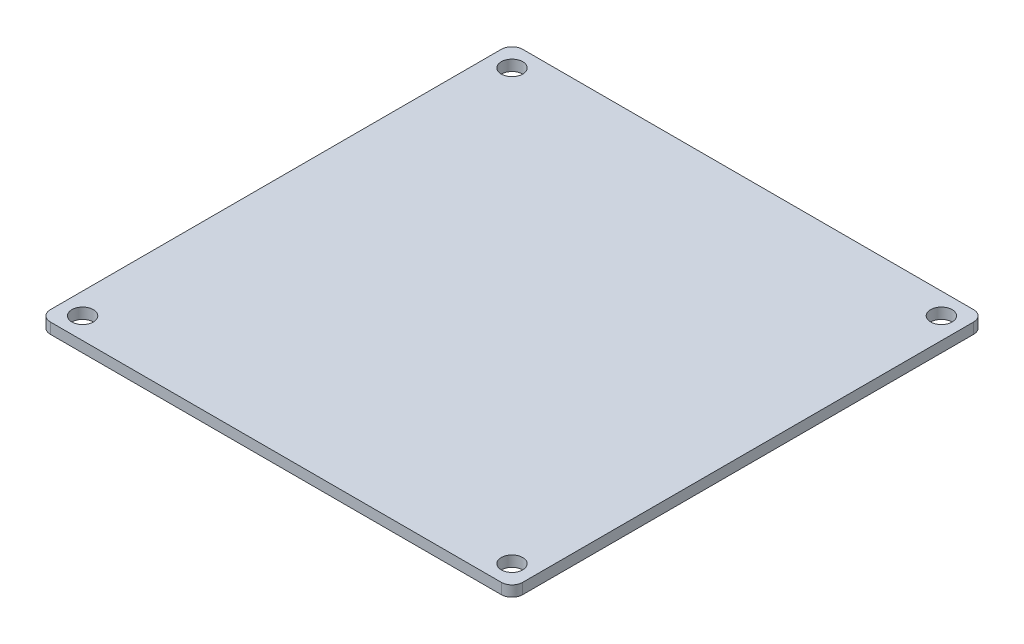
ISO-10303-21;
HEADER;
FILE_DESCRIPTION(('STEP AP214'),'2;1');
FILE_NAME('part.step','',(''),(''),'','','');
FILE_SCHEMA(('AUTOMOTIVE_DESIGN { 1 0 10303 214 1 1 1 1 }'));
ENDSEC;
DATA;
#1=APPLICATION_CONTEXT('core data for automotive mechanical design processes');
#2=APPLICATION_PROTOCOL_DEFINITION('international standard','automotive_design',2000,#1);
#3=PRODUCT_CONTEXT('',#1,'mechanical');
#4=PRODUCT('Part','Part','',(#3));
#5=PRODUCT_RELATED_PRODUCT_CATEGORY('part','',(#4));
#6=PRODUCT_DEFINITION_FORMATION('','',#4);
#7=PRODUCT_DEFINITION_CONTEXT('part definition',#1,'design');
#8=PRODUCT_DEFINITION('design','',#6,#7);
#9=PRODUCT_DEFINITION_SHAPE('','',#8);
#10=(LENGTH_UNIT() NAMED_UNIT(*) SI_UNIT(.MILLI.,.METRE.));
#11=(NAMED_UNIT(*) PLANE_ANGLE_UNIT() SI_UNIT($,.RADIAN.));
#12=(NAMED_UNIT(*) SI_UNIT($,.STERADIAN.) SOLID_ANGLE_UNIT());
#13=UNCERTAINTY_MEASURE_WITH_UNIT(LENGTH_MEASURE(1.E-05),#10,'distance_accuracy_value','');
#14=(GEOMETRIC_REPRESENTATION_CONTEXT(3) GLOBAL_UNCERTAINTY_ASSIGNED_CONTEXT((#13)) GLOBAL_UNIT_ASSIGNED_CONTEXT((#10,
#11,#12)) REPRESENTATION_CONTEXT('',''));
#15=CARTESIAN_POINT('',(0.,0.,0.));
#16=DIRECTION('',(0.,0.,1.));
#17=DIRECTION('',(1.,0.,0.));
#18=AXIS2_PLACEMENT_3D('',#15,#16,#17);
#19=CARTESIAN_POINT('',(-31.5,1.5,31.5));
#20=DIRECTION('',(0.,1.,0.));
#21=DIRECTION('',(0.,0.,1.));
#22=AXIS2_PLACEMENT_3D('',#19,#20,#21);
#23=PLANE('',#22);
#24=CARTESIAN_POINT('',(30.,1.5,30.));
#25=DIRECTION('',(0.,1.,0.));
#26=DIRECTION('',(0.,0.,1.));
#27=AXIS2_PLACEMENT_3D('',#24,#25,#26);
#28=CIRCLE('',#27,1.5);
#29=CARTESIAN_POINT('',(30.,1.5,31.5));
#30=VERTEX_POINT('',#29);
#31=EDGE_CURVE('E231',#30,#30,#28,.T.);
#32=ORIENTED_EDGE('',*,*,#31,.F.);
#33=EDGE_LOOP('',(#32));
#34=FACE_BOUND('',#33,.T.);
#35=CARTESIAN_POINT('',(-30.,1.5,-30.));
#36=DIRECTION('',(0.,1.,0.));
#37=DIRECTION('',(0.,0.,1.));
#38=AXIS2_PLACEMENT_3D('',#35,#36,#37);
#39=CIRCLE('',#38,1.5);
#40=CARTESIAN_POINT('',(-30.,1.5,-28.5));
#41=VERTEX_POINT('',#40);
#42=EDGE_CURVE('E156',#41,#41,#39,.T.);
#43=ORIENTED_EDGE('',*,*,#42,.F.);
#44=EDGE_LOOP('',(#43));
#45=FACE_BOUND('',#44,.T.);
#46=CARTESIAN_POINT('',(-31.5,1.5,31.5));
#47=DIRECTION('',(0.,1.,0.));
#48=DIRECTION('',(0.,0.,1.));
#49=AXIS2_PLACEMENT_3D('',#46,#47,#48);
#50=CIRCLE('',#49,1.5);
#51=CARTESIAN_POINT('',(-33.,1.5,31.5));
#52=VERTEX_POINT('',#51);
#53=CARTESIAN_POINT('',(-31.5,1.5,33.));
#54=VERTEX_POINT('',#53);
#55=EDGE_CURVE('E174',#52,#54,#50,.T.);
#56=ORIENTED_EDGE('',*,*,#55,.T.);
#57=DIRECTION('',(1.,0.,0.));
#58=VECTOR('',#57,1.);
#59=CARTESIAN_POINT('',(-31.5,1.5,33.));
#60=LINE('',#59,#58);
#61=CARTESIAN_POINT('',(31.5,1.5,33.));
#62=VERTEX_POINT('',#61);
#63=EDGE_CURVE('E110',#54,#62,#60,.T.);
#64=ORIENTED_EDGE('',*,*,#63,.T.);
#65=CARTESIAN_POINT('',(31.5,1.5,31.5));
#66=DIRECTION('',(0.,1.,0.));
#67=DIRECTION('',(0.,0.,1.));
#68=AXIS2_PLACEMENT_3D('',#65,#66,#67);
#69=CIRCLE('',#68,1.5);
#70=CARTESIAN_POINT('',(33.,1.5,31.5));
#71=VERTEX_POINT('',#70);
#72=EDGE_CURVE('E195',#62,#71,#69,.T.);
#73=ORIENTED_EDGE('',*,*,#72,.T.);
#74=DIRECTION('',(0.,0.,-1.));
#75=VECTOR('',#74,1.);
#76=CARTESIAN_POINT('',(33.,1.5,-31.5));
#77=LINE('',#76,#75);
#78=CARTESIAN_POINT('',(33.,1.5,-31.5));
#79=VERTEX_POINT('',#78);
#80=EDGE_CURVE('E209',#71,#79,#77,.T.);
#81=ORIENTED_EDGE('',*,*,#80,.T.);
#82=CARTESIAN_POINT('',(31.5,1.5,-31.5));
#83=DIRECTION('',(0.,1.,0.));
#84=DIRECTION('',(0.,0.,-1.));
#85=AXIS2_PLACEMENT_3D('',#82,#83,#84);
#86=CIRCLE('',#85,1.5);
#87=CARTESIAN_POINT('',(31.5,1.5,-33.));
#88=VERTEX_POINT('',#87);
#89=EDGE_CURVE('E129',#79,#88,#86,.T.);
#90=ORIENTED_EDGE('',*,*,#89,.T.);
#91=DIRECTION('',(-1.,0.,0.));
#92=VECTOR('',#91,1.);
#93=CARTESIAN_POINT('',(-31.5,1.5,-33.));
#94=LINE('',#93,#92);
#95=CARTESIAN_POINT('',(-31.5,1.5,-33.));
#96=VERTEX_POINT('',#95);
#97=EDGE_CURVE('E123',#88,#96,#94,.T.);
#98=ORIENTED_EDGE('',*,*,#97,.T.);
#99=CARTESIAN_POINT('',(-31.5,1.5,-31.5));
#100=DIRECTION('',(0.,1.,0.));
#101=DIRECTION('',(0.,0.,1.));
#102=AXIS2_PLACEMENT_3D('',#99,#100,#101);
#103=CIRCLE('',#102,1.5);
#104=CARTESIAN_POINT('',(-33.,1.5,-31.5));
#105=VERTEX_POINT('',#104);
#106=EDGE_CURVE('E127',#96,#105,#103,.T.);
#107=ORIENTED_EDGE('',*,*,#106,.T.);
#108=DIRECTION('',(0.,0.,1.));
#109=VECTOR('',#108,1.);
#110=CARTESIAN_POINT('',(-33.,1.5,-31.5));
#111=LINE('',#110,#109);
#112=EDGE_CURVE('E67',#105,#52,#111,.T.);
#113=ORIENTED_EDGE('',*,*,#112,.T.);
#114=EDGE_LOOP('',(#56,#64,#73,#81,#90,#98,#107,#113));
#115=FACE_BOUND('',#114,.T.);
#116=CARTESIAN_POINT('',(30.,1.5,-30.));
#117=DIRECTION('',(0.,1.,0.));
#118=DIRECTION('',(0.,0.,1.));
#119=AXIS2_PLACEMENT_3D('',#116,#117,#118);
#120=CIRCLE('',#119,1.5);
#121=CARTESIAN_POINT('',(30.,1.5,-28.5));
#122=VERTEX_POINT('',#121);
#123=EDGE_CURVE('E223',#122,#122,#120,.T.);
#124=ORIENTED_EDGE('',*,*,#123,.F.);
#125=EDGE_LOOP('',(#124));
#126=FACE_BOUND('',#125,.T.);
#127=CARTESIAN_POINT('',(-30.,1.5,30.));
#128=DIRECTION('',(0.,1.,0.));
#129=DIRECTION('',(0.,0.,1.));
#130=AXIS2_PLACEMENT_3D('',#127,#128,#129);
#131=CIRCLE('',#130,1.5);
#132=CARTESIAN_POINT('',(-30.,1.5,31.5));
#133=VERTEX_POINT('',#132);
#134=EDGE_CURVE('E239',#133,#133,#131,.T.);
#135=ORIENTED_EDGE('',*,*,#134,.F.);
#136=EDGE_LOOP('',(#135));
#137=FACE_BOUND('',#136,.T.);
#138=ADVANCED_FACE('F49',(#34,#45,#115,#126,#137),#23,.T.);
#139=CARTESIAN_POINT('',(-31.5,0.,31.5));
#140=DIRECTION('',(0.,1.,0.));
#141=DIRECTION('',(0.,0.,1.));
#142=AXIS2_PLACEMENT_3D('',#139,#140,#141);
#143=PLANE('',#142);
#144=CARTESIAN_POINT('',(-31.5,0.,31.5));
#145=DIRECTION('',(0.,1.,0.));
#146=DIRECTION('',(0.,0.,1.));
#147=AXIS2_PLACEMENT_3D('',#144,#145,#146);
#148=CIRCLE('',#147,1.5);
#149=CARTESIAN_POINT('',(-33.,0.,31.5));
#150=VERTEX_POINT('',#149);
#151=CARTESIAN_POINT('',(-31.5,0.,33.));
#152=VERTEX_POINT('',#151);
#153=EDGE_CURVE('E151',#150,#152,#148,.T.);
#154=ORIENTED_EDGE('',*,*,#153,.F.);
#155=DIRECTION('',(0.,0.,1.));
#156=VECTOR('',#155,1.);
#157=CARTESIAN_POINT('',(-33.,0.,-31.5));
#158=LINE('',#157,#156);
#159=CARTESIAN_POINT('',(-33.,0.,-31.5));
#160=VERTEX_POINT('',#159);
#161=EDGE_CURVE('E102',#160,#150,#158,.T.);
#162=ORIENTED_EDGE('',*,*,#161,.F.);
#163=CARTESIAN_POINT('',(-31.5,0.,-31.5));
#164=DIRECTION('',(0.,1.,0.));
#165=DIRECTION('',(0.,0.,1.));
#166=AXIS2_PLACEMENT_3D('',#163,#164,#165);
#167=CIRCLE('',#166,1.5);
#168=CARTESIAN_POINT('',(-31.5,0.,-33.));
#169=VERTEX_POINT('',#168);
#170=EDGE_CURVE('E96',#169,#160,#167,.T.);
#171=ORIENTED_EDGE('',*,*,#170,.F.);
#172=DIRECTION('',(-1.,0.,0.));
#173=VECTOR('',#172,1.);
#174=CARTESIAN_POINT('',(-31.5,0.,-33.));
#175=LINE('',#174,#173);
#176=CARTESIAN_POINT('',(31.5,0.,-33.));
#177=VERTEX_POINT('',#176);
#178=EDGE_CURVE('E138',#177,#169,#175,.T.);
#179=ORIENTED_EDGE('',*,*,#178,.F.);
#180=CARTESIAN_POINT('',(31.5,0.,-31.5));
#181=DIRECTION('',(0.,1.,0.));
#182=DIRECTION('',(0.,0.,-1.));
#183=AXIS2_PLACEMENT_3D('',#180,#181,#182);
#184=CIRCLE('',#183,1.5);
#185=CARTESIAN_POINT('',(33.,0.,-31.5));
#186=VERTEX_POINT('',#185);
#187=EDGE_CURVE('E165',#186,#177,#184,.T.);
#188=ORIENTED_EDGE('',*,*,#187,.F.);
#189=DIRECTION('',(0.,0.,-1.));
#190=VECTOR('',#189,1.);
#191=CARTESIAN_POINT('',(33.,0.,-31.5));
#192=LINE('',#191,#190);
#193=CARTESIAN_POINT('',(33.,0.,31.5));
#194=VERTEX_POINT('',#193);
#195=EDGE_CURVE('E162',#194,#186,#192,.T.);
#196=ORIENTED_EDGE('',*,*,#195,.F.);
#197=CARTESIAN_POINT('',(31.5,0.,31.5));
#198=DIRECTION('',(0.,1.,0.));
#199=DIRECTION('',(0.,0.,1.));
#200=AXIS2_PLACEMENT_3D('',#197,#198,#199);
#201=CIRCLE('',#200,1.5);
#202=CARTESIAN_POINT('',(31.5,0.,33.));
#203=VERTEX_POINT('',#202);
#204=EDGE_CURVE('E159',#203,#194,#201,.T.);
#205=ORIENTED_EDGE('',*,*,#204,.F.);
#206=DIRECTION('',(1.,0.,0.));
#207=VECTOR('',#206,1.);
#208=CARTESIAN_POINT('',(-31.5,0.,33.));
#209=LINE('',#208,#207);
#210=EDGE_CURVE('E155',#152,#203,#209,.T.);
#211=ORIENTED_EDGE('',*,*,#210,.F.);
#212=EDGE_LOOP('',(#154,#162,#171,#179,#188,#196,#205,#211));
#213=FACE_BOUND('',#212,.T.);
#214=CARTESIAN_POINT('',(-30.,0.,-30.));
#215=DIRECTION('',(0.,1.,0.));
#216=DIRECTION('',(0.,0.,1.));
#217=AXIS2_PLACEMENT_3D('',#214,#215,#216);
#218=CIRCLE('',#217,1.5);
#219=CARTESIAN_POINT('',(-30.,0.,-28.5));
#220=VERTEX_POINT('',#219);
#221=EDGE_CURVE('E219',#220,#220,#218,.T.);
#222=ORIENTED_EDGE('',*,*,#221,.T.);
#223=EDGE_LOOP('',(#222));
#224=FACE_BOUND('',#223,.T.);
#225=CARTESIAN_POINT('',(30.,0.,-30.));
#226=DIRECTION('',(0.,1.,0.));
#227=DIRECTION('',(0.,0.,1.));
#228=AXIS2_PLACEMENT_3D('',#225,#226,#227);
#229=CIRCLE('',#228,1.5);
#230=CARTESIAN_POINT('',(30.,0.,-28.5));
#231=VERTEX_POINT('',#230);
#232=EDGE_CURVE('E227',#231,#231,#229,.T.);
#233=ORIENTED_EDGE('',*,*,#232,.T.);
#234=EDGE_LOOP('',(#233));
#235=FACE_BOUND('',#234,.T.);
#236=CARTESIAN_POINT('',(30.,0.,30.));
#237=DIRECTION('',(0.,1.,0.));
#238=DIRECTION('',(0.,0.,1.));
#239=AXIS2_PLACEMENT_3D('',#236,#237,#238);
#240=CIRCLE('',#239,1.5);
#241=CARTESIAN_POINT('',(30.,0.,31.5));
#242=VERTEX_POINT('',#241);
#243=EDGE_CURVE('E235',#242,#242,#240,.T.);
#244=ORIENTED_EDGE('',*,*,#243,.T.);
#245=EDGE_LOOP('',(#244));
#246=FACE_BOUND('',#245,.T.);
#247=CARTESIAN_POINT('',(-30.,0.,30.));
#248=DIRECTION('',(0.,1.,0.));
#249=DIRECTION('',(0.,0.,1.));
#250=AXIS2_PLACEMENT_3D('',#247,#248,#249);
#251=CIRCLE('',#250,1.5);
#252=CARTESIAN_POINT('',(-30.,0.,31.5));
#253=VERTEX_POINT('',#252);
#254=EDGE_CURVE('E243',#253,#253,#251,.T.);
#255=ORIENTED_EDGE('',*,*,#254,.T.);
#256=EDGE_LOOP('',(#255));
#257=FACE_BOUND('',#256,.T.);
#258=ADVANCED_FACE('F199',(#213,#224,#235,#246,#257),#143,.F.);
#259=CARTESIAN_POINT('',(-31.5,1.5,31.5));
#260=DIRECTION('',(0.,-1.,0.));
#261=DIRECTION('',(0.,0.,-1.));
#262=AXIS2_PLACEMENT_3D('',#259,#260,#261);
#263=CYLINDRICAL_SURFACE('',#262,1.5);
#264=ORIENTED_EDGE('',*,*,#153,.T.);
#265=DIRECTION('',(0.,-1.,0.));
#266=VECTOR('',#265,1.);
#267=CARTESIAN_POINT('',(-31.5,1.5,33.));
#268=LINE('',#267,#266);
#269=EDGE_CURVE('E11',#54,#152,#268,.T.);
#270=ORIENTED_EDGE('',*,*,#269,.F.);
#271=ORIENTED_EDGE('',*,*,#55,.F.);
#272=DIRECTION('',(0.,-1.,0.));
#273=VECTOR('',#272,1.);
#274=CARTESIAN_POINT('',(-33.,1.5,31.5));
#275=LINE('',#274,#273);
#276=EDGE_CURVE('E147',#52,#150,#275,.T.);
#277=ORIENTED_EDGE('',*,*,#276,.T.);
#278=EDGE_LOOP('',(#264,#270,#271,#277));
#279=FACE_BOUND('',#278,.T.);
#280=ADVANCED_FACE('F51',(#279),#263,.T.);
#281=CARTESIAN_POINT('',(-31.5,1.5,33.));
#282=DIRECTION('',(0.,0.,-1.));
#283=DIRECTION('',(-1.,0.,0.));
#284=AXIS2_PLACEMENT_3D('',#281,#282,#283);
#285=PLANE('',#284);
#286=ORIENTED_EDGE('',*,*,#210,.T.);
#287=DIRECTION('',(0.,-1.,0.));
#288=VECTOR('',#287,1.);
#289=CARTESIAN_POINT('',(31.5,1.5,33.));
#290=LINE('',#289,#288);
#291=EDGE_CURVE('E59',#62,#203,#290,.T.);
#292=ORIENTED_EDGE('',*,*,#291,.F.);
#293=ORIENTED_EDGE('',*,*,#63,.F.);
#294=ORIENTED_EDGE('',*,*,#269,.T.);
#295=EDGE_LOOP('',(#286,#292,#293,#294));
#296=FACE_BOUND('',#295,.T.);
#297=ADVANCED_FACE('F279',(#296),#285,.F.);
#298=CARTESIAN_POINT('',(31.5,1.5,31.5));
#299=DIRECTION('',(0.,-1.,0.));
#300=DIRECTION('',(0.,0.,-1.));
#301=AXIS2_PLACEMENT_3D('',#298,#299,#300);
#302=CYLINDRICAL_SURFACE('',#301,1.5);
#303=ORIENTED_EDGE('',*,*,#204,.T.);
#304=DIRECTION('',(0.,-1.,0.));
#305=VECTOR('',#304,1.);
#306=CARTESIAN_POINT('',(33.,1.5,31.5));
#307=LINE('',#306,#305);
#308=EDGE_CURVE('E185',#71,#194,#307,.T.);
#309=ORIENTED_EDGE('',*,*,#308,.F.);
#310=ORIENTED_EDGE('',*,*,#72,.F.);
#311=ORIENTED_EDGE('',*,*,#291,.T.);
#312=EDGE_LOOP('',(#303,#309,#310,#311));
#313=FACE_BOUND('',#312,.T.);
#314=ADVANCED_FACE('F193',(#313),#302,.T.);
#315=CARTESIAN_POINT('',(33.,1.5,-31.5));
#316=DIRECTION('',(-1.,0.,0.));
#317=DIRECTION('',(0.,0.,1.));
#318=AXIS2_PLACEMENT_3D('',#315,#316,#317);
#319=PLANE('',#318);
#320=ORIENTED_EDGE('',*,*,#195,.T.);
#321=DIRECTION('',(0.,-1.,0.));
#322=VECTOR('',#321,1.);
#323=CARTESIAN_POINT('',(33.,1.5,-31.5));
#324=LINE('',#323,#322);
#325=EDGE_CURVE('E181',#79,#186,#324,.T.);
#326=ORIENTED_EDGE('',*,*,#325,.F.);
#327=ORIENTED_EDGE('',*,*,#80,.F.);
#328=ORIENTED_EDGE('',*,*,#308,.T.);
#329=EDGE_LOOP('',(#320,#326,#327,#328));
#330=FACE_BOUND('',#329,.T.);
#331=ADVANCED_FACE('F204',(#330),#319,.F.);
#332=CARTESIAN_POINT('',(31.5,1.5,-31.5));
#333=DIRECTION('',(0.,-1.,0.));
#334=DIRECTION('',(0.,0.,-1.));
#335=AXIS2_PLACEMENT_3D('',#332,#333,#334);
#336=CYLINDRICAL_SURFACE('',#335,1.5);
#337=ORIENTED_EDGE('',*,*,#187,.T.);
#338=DIRECTION('',(0.,-1.,0.));
#339=VECTOR('',#338,1.);
#340=CARTESIAN_POINT('',(31.5,1.5,-33.));
#341=LINE('',#340,#339);
#342=EDGE_CURVE('E140',#88,#177,#341,.T.);
#343=ORIENTED_EDGE('',*,*,#342,.F.);
#344=ORIENTED_EDGE('',*,*,#89,.F.);
#345=ORIENTED_EDGE('',*,*,#325,.T.);
#346=EDGE_LOOP('',(#337,#343,#344,#345));
#347=FACE_BOUND('',#346,.T.);
#348=ADVANCED_FACE('F207',(#347),#336,.T.);
#349=CARTESIAN_POINT('',(-31.5,1.5,-33.));
#350=DIRECTION('',(0.,0.,1.));
#351=DIRECTION('',(1.,0.,0.));
#352=AXIS2_PLACEMENT_3D('',#349,#350,#351);
#353=PLANE('',#352);
#354=ORIENTED_EDGE('',*,*,#178,.T.);
#355=DIRECTION('',(0.,-1.,0.));
#356=VECTOR('',#355,1.);
#357=CARTESIAN_POINT('',(-31.5,1.5,-33.));
#358=LINE('',#357,#356);
#359=EDGE_CURVE('E135',#96,#169,#358,.T.);
#360=ORIENTED_EDGE('',*,*,#359,.F.);
#361=ORIENTED_EDGE('',*,*,#97,.F.);
#362=ORIENTED_EDGE('',*,*,#342,.T.);
#363=EDGE_LOOP('',(#354,#360,#361,#362));
#364=FACE_BOUND('',#363,.T.);
#365=ADVANCED_FACE('F136',(#364),#353,.F.);
#366=CARTESIAN_POINT('',(-31.5,1.5,-31.5));
#367=DIRECTION('',(0.,-1.,0.));
#368=DIRECTION('',(0.,0.,-1.));
#369=AXIS2_PLACEMENT_3D('',#366,#367,#368);
#370=CYLINDRICAL_SURFACE('',#369,1.5);
#371=ORIENTED_EDGE('',*,*,#170,.T.);
#372=DIRECTION('',(0.,-1.,0.));
#373=VECTOR('',#372,1.);
#374=CARTESIAN_POINT('',(-33.,1.5,-31.5));
#375=LINE('',#374,#373);
#376=EDGE_CURVE('E141',#105,#160,#375,.T.);
#377=ORIENTED_EDGE('',*,*,#376,.F.);
#378=ORIENTED_EDGE('',*,*,#106,.F.);
#379=ORIENTED_EDGE('',*,*,#359,.T.);
#380=EDGE_LOOP('',(#371,#377,#378,#379));
#381=FACE_BOUND('',#380,.T.);
#382=ADVANCED_FACE('F143',(#381),#370,.T.);
#383=CARTESIAN_POINT('',(-33.,1.5,-31.5));
#384=DIRECTION('',(1.,0.,0.));
#385=DIRECTION('',(0.,0.,-1.));
#386=AXIS2_PLACEMENT_3D('',#383,#384,#385);
#387=PLANE('',#386);
#388=ORIENTED_EDGE('',*,*,#161,.T.);
#389=ORIENTED_EDGE('',*,*,#276,.F.);
#390=ORIENTED_EDGE('',*,*,#112,.F.);
#391=ORIENTED_EDGE('',*,*,#376,.T.);
#392=EDGE_LOOP('',(#388,#389,#390,#391));
#393=FACE_BOUND('',#392,.T.);
#394=ADVANCED_FACE('F267',(#393),#387,.F.);
#395=CARTESIAN_POINT('',(-30.,1.5,-30.));
#396=DIRECTION('',(0.,-1.,0.));
#397=DIRECTION('',(0.,0.,-1.));
#398=AXIS2_PLACEMENT_3D('',#395,#396,#397);
#399=CYLINDRICAL_SURFACE('',#398,1.5);
#400=ORIENTED_EDGE('',*,*,#42,.T.);
#401=EDGE_LOOP('',(#400));
#402=FACE_BOUND('',#401,.T.);
#403=ORIENTED_EDGE('',*,*,#221,.F.);
#404=EDGE_LOOP('',(#403));
#405=FACE_BOUND('',#404,.T.);
#406=ADVANCED_FACE('F264',(#402,#405),#399,.F.);
#407=CARTESIAN_POINT('',(30.,1.5,-30.));
#408=DIRECTION('',(0.,-1.,0.));
#409=DIRECTION('',(0.,0.,-1.));
#410=AXIS2_PLACEMENT_3D('',#407,#408,#409);
#411=CYLINDRICAL_SURFACE('',#410,1.5);
#412=ORIENTED_EDGE('',*,*,#123,.T.);
#413=EDGE_LOOP('',(#412));
#414=FACE_BOUND('',#413,.T.);
#415=ORIENTED_EDGE('',*,*,#232,.F.);
#416=EDGE_LOOP('',(#415));
#417=FACE_BOUND('',#416,.T.);
#418=ADVANCED_FACE('F377',(#414,#417),#411,.F.);
#419=CARTESIAN_POINT('',(30.,1.5,30.));
#420=DIRECTION('',(0.,-1.,0.));
#421=DIRECTION('',(0.,0.,-1.));
#422=AXIS2_PLACEMENT_3D('',#419,#420,#421);
#423=CYLINDRICAL_SURFACE('',#422,1.5);
#424=ORIENTED_EDGE('',*,*,#31,.T.);
#425=EDGE_LOOP('',(#424));
#426=FACE_BOUND('',#425,.T.);
#427=ORIENTED_EDGE('',*,*,#243,.F.);
#428=EDGE_LOOP('',(#427));
#429=FACE_BOUND('',#428,.T.);
#430=ADVANCED_FACE('F388',(#426,#429),#423,.F.);
#431=CARTESIAN_POINT('',(-30.,1.5,30.));
#432=DIRECTION('',(0.,-1.,0.));
#433=DIRECTION('',(0.,0.,-1.));
#434=AXIS2_PLACEMENT_3D('',#431,#432,#433);
#435=CYLINDRICAL_SURFACE('',#434,1.5);
#436=ORIENTED_EDGE('',*,*,#134,.T.);
#437=EDGE_LOOP('',(#436));
#438=FACE_BOUND('',#437,.T.);
#439=ORIENTED_EDGE('',*,*,#254,.F.);
#440=EDGE_LOOP('',(#439));
#441=FACE_BOUND('',#440,.T.);
#442=ADVANCED_FACE('F251',(#438,#441),#435,.F.);
#443=CLOSED_SHELL('',(#138,#258,#280,#297,#314,#331,#348,#365,#382,#394,#406,#418,#430,#442));
#444=MANIFOLD_SOLID_BREP('B2',#443);
#445=ADVANCED_BREP_SHAPE_REPRESENTATION('',(#18,#444),#14);
#446=SHAPE_DEFINITION_REPRESENTATION(#9,#445);
ENDSEC;
END-ISO-10303-21;
